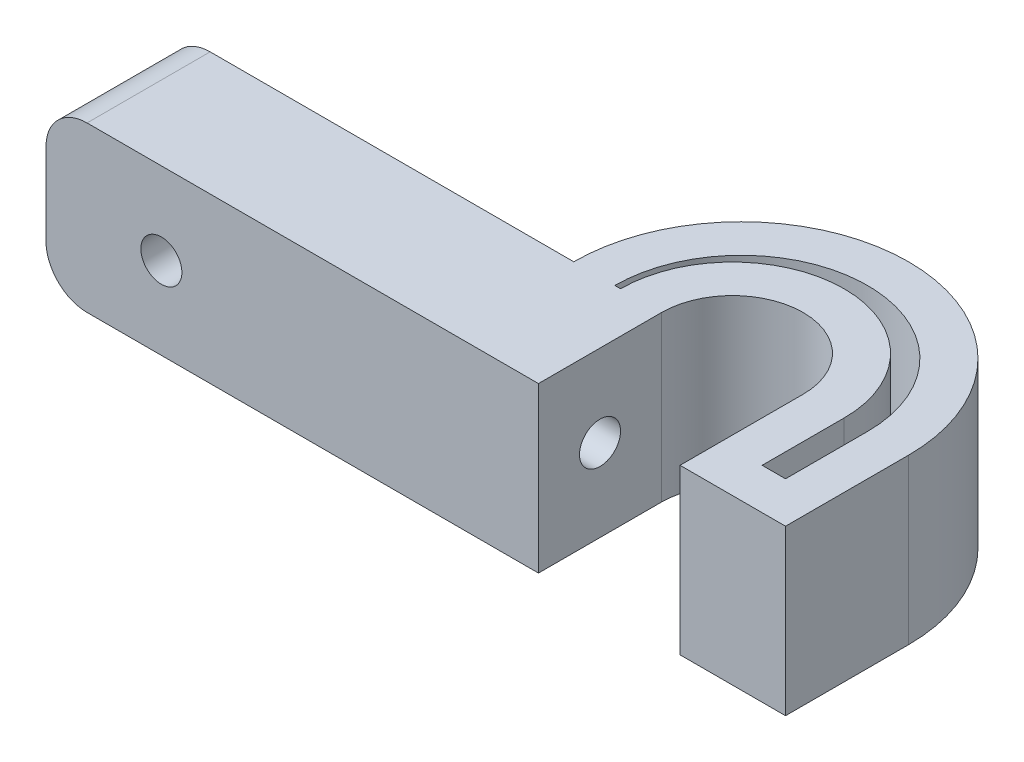
ISO-10303-21;
HEADER;
FILE_DESCRIPTION(('STEP AP214'),'2;1');
FILE_NAME('part.step','',(''),(''),'','','');
FILE_SCHEMA(('AUTOMOTIVE_DESIGN { 1 0 10303 214 1 1 1 1 }'));
ENDSEC;
DATA;
#1=APPLICATION_CONTEXT('core data for automotive mechanical design processes');
#2=APPLICATION_PROTOCOL_DEFINITION('international standard','automotive_design',2000,#1);
#3=PRODUCT_CONTEXT('',#1,'mechanical');
#4=PRODUCT('Part','Part','',(#3));
#5=PRODUCT_RELATED_PRODUCT_CATEGORY('part','',(#4));
#6=PRODUCT_DEFINITION_FORMATION('','',#4);
#7=PRODUCT_DEFINITION_CONTEXT('part definition',#1,'design');
#8=PRODUCT_DEFINITION('design','',#6,#7);
#9=PRODUCT_DEFINITION_SHAPE('','',#8);
#10=(LENGTH_UNIT() NAMED_UNIT(*) SI_UNIT(.MILLI.,.METRE.));
#11=(NAMED_UNIT(*) PLANE_ANGLE_UNIT() SI_UNIT($,.RADIAN.));
#12=(NAMED_UNIT(*) SI_UNIT($,.STERADIAN.) SOLID_ANGLE_UNIT());
#13=UNCERTAINTY_MEASURE_WITH_UNIT(LENGTH_MEASURE(1.E-05),#10,'distance_accuracy_value','');
#14=(GEOMETRIC_REPRESENTATION_CONTEXT(3) GLOBAL_UNCERTAINTY_ASSIGNED_CONTEXT((#13)) GLOBAL_UNIT_ASSIGNED_CONTEXT((#10,
#11,#12)) REPRESENTATION_CONTEXT('',''));
#15=CARTESIAN_POINT('',(0.,0.,0.));
#16=DIRECTION('',(0.,0.,1.));
#17=DIRECTION('',(1.,0.,0.));
#18=AXIS2_PLACEMENT_3D('',#15,#16,#17);
#19=CARTESIAN_POINT('',(-50.,10.,0.));
#20=DIRECTION('',(0.,0.,-1.));
#21=DIRECTION('',(-1.,0.,0.));
#22=AXIS2_PLACEMENT_3D('',#19,#20,#21);
#23=PLANE('',#22);
#24=DIRECTION('',(1.,0.,0.));
#25=VECTOR('',#24,1.);
#26=CARTESIAN_POINT('',(-49.9999999999999,-20.,0.));
#27=LINE('',#26,#25);
#28=CARTESIAN_POINT('',(48.6040885521621,-20.,0.));
#29=VERTEX_POINT('',#28);
#30=CARTESIAN_POINT('',(50.,-20.,0.));
#31=VERTEX_POINT('',#30);
#32=EDGE_CURVE('E158',#29,#31,#27,.T.);
#33=ORIENTED_EDGE('',*,*,#32,.F.);
#34=DIRECTION('',(0.,1.,0.));
#35=VECTOR('',#34,1.);
#36=CARTESIAN_POINT('',(48.6040885521621,-20.,0.));
#37=LINE('',#36,#35);
#38=CARTESIAN_POINT('',(48.6040885521621,20.,0.));
#39=VERTEX_POINT('',#38);
#40=EDGE_CURVE('E168',#29,#39,#37,.T.);
#41=ORIENTED_EDGE('',*,*,#40,.T.);
#42=DIRECTION('',(-1.,0.,0.));
#43=VECTOR('',#42,1.);
#44=CARTESIAN_POINT('',(-49.9999999999999,20.,0.));
#45=LINE('',#44,#43);
#46=CARTESIAN_POINT('',(50.,20.,0.));
#47=VERTEX_POINT('',#46);
#48=EDGE_CURVE('E217',#47,#39,#45,.T.);
#49=ORIENTED_EDGE('',*,*,#48,.F.);
#50=DIRECTION('',(0.,1.,0.));
#51=VECTOR('',#50,1.);
#52=CARTESIAN_POINT('',(50.,-20.,0.));
#53=LINE('',#52,#51);
#54=EDGE_CURVE('E178',#31,#47,#53,.T.);
#55=ORIENTED_EDGE('',*,*,#54,.F.);
#56=EDGE_LOOP('',(#33,#41,#49,#55));
#57=FACE_BOUND('',#56,.T.);
#58=ADVANCED_FACE('F33',(#57),#23,.T.);
#59=DIRECTION('',(0.,1.,0.));
#60=VECTOR('',#59,1.);
#61=CARTESIAN_POINT('',(38.6040885521621,-20.,0.));
#62=LINE('',#61,#60);
#63=CARTESIAN_POINT('',(38.6040885521621,-20.,0.));
#64=VERTEX_POINT('',#63);
#65=CARTESIAN_POINT('',(38.6040885521621,20.,0.));
#66=VERTEX_POINT('',#65);
#67=EDGE_CURVE('E175',#64,#66,#62,.T.);
#68=ORIENTED_EDGE('',*,*,#67,.F.);
#69=CARTESIAN_POINT('',(-49.9999999999999,-20.,0.));
#70=VERTEX_POINT('',#69);
#71=EDGE_CURVE('E179',#70,#64,#27,.T.);
#72=ORIENTED_EDGE('',*,*,#71,.F.);
#73=CARTESIAN_POINT('',(-50.,-10.,0.));
#74=DIRECTION('',(0.,0.,1.));
#75=DIRECTION('',(-1.,0.,0.));
#76=AXIS2_PLACEMENT_3D('',#73,#74,#75);
#77=CIRCLE('',#76,10.);
#78=CARTESIAN_POINT('',(-60.,-10.,0.));
#79=VERTEX_POINT('',#78);
#80=EDGE_CURVE('E180',#79,#70,#77,.T.);
#81=ORIENTED_EDGE('',*,*,#80,.F.);
#82=DIRECTION('',(0.,-1.,0.));
#83=VECTOR('',#82,1.);
#84=CARTESIAN_POINT('',(-60.,-9.99999999999993,0.));
#85=LINE('',#84,#83);
#86=CARTESIAN_POINT('',(-60.,9.99999999999993,0.));
#87=VERTEX_POINT('',#86);
#88=EDGE_CURVE('E184',#87,#79,#85,.T.);
#89=ORIENTED_EDGE('',*,*,#88,.F.);
#90=CARTESIAN_POINT('',(-50.,10.,0.));
#91=DIRECTION('',(0.,0.,1.));
#92=DIRECTION('',(-1.,0.,0.));
#93=AXIS2_PLACEMENT_3D('',#90,#91,#92);
#94=CIRCLE('',#93,10.);
#95=CARTESIAN_POINT('',(-49.9999999999999,20.,0.));
#96=VERTEX_POINT('',#95);
#97=EDGE_CURVE('E207',#96,#87,#94,.T.);
#98=ORIENTED_EDGE('',*,*,#97,.F.);
#99=EDGE_CURVE('E215',#66,#96,#45,.T.);
#100=ORIENTED_EDGE('',*,*,#99,.F.);
#101=EDGE_LOOP('',(#68,#72,#81,#89,#98,#100));
#102=FACE_BOUND('',#101,.T.);
#103=CARTESIAN_POINT('',(-31.8867800357313,0.,0.));
#104=DIRECTION('',(0.,0.,-1.));
#105=DIRECTION('',(-1.,0.,0.));
#106=AXIS2_PLACEMENT_3D('',#103,#104,#105);
#107=CIRCLE('',#106,5.);
#108=CARTESIAN_POINT('',(-36.8867800357313,0.,0.));
#109=VERTEX_POINT('',#108);
#110=EDGE_CURVE('E237',#109,#109,#107,.T.);
#111=ORIENTED_EDGE('',*,*,#110,.F.);
#112=EDGE_LOOP('',(#111));
#113=FACE_BOUND('',#112,.T.);
#114=ADVANCED_FACE('F213',(#102,#113),#23,.T.);
#115=CARTESIAN_POINT('',(60.,-20.,30.));
#116=DIRECTION('',(-1.,0.,0.));
#117=DIRECTION('',(0.,0.,1.));
#118=AXIS2_PLACEMENT_3D('',#115,#116,#117);
#119=PLANE('',#118);
#120=CARTESIAN_POINT('',(60.,1.14491749414469E-13,14.9999999999999));
#121=DIRECTION('',(1.,0.,0.));
#122=DIRECTION('',(0.,0.,-1.));
#123=AXIS2_PLACEMENT_3D('',#120,#121,#122);
#124=CIRCLE('',#123,5.);
#125=CARTESIAN_POINT('',(60.,1.14491749414469E-13,9.9999999999999));
#126=VERTEX_POINT('',#125);
#127=EDGE_CURVE('E174',#126,#126,#124,.T.);
#128=ORIENTED_EDGE('',*,*,#127,.F.);
#129=EDGE_LOOP('',(#128));
#130=FACE_BOUND('',#129,.T.);
#131=DIRECTION('',(0.,1.,0.));
#132=VECTOR('',#131,1.);
#133=CARTESIAN_POINT('',(60.,-20.,0.));
#134=LINE('',#133,#132);
#135=CARTESIAN_POINT('',(60.,-20.,0.));
#136=VERTEX_POINT('',#135);
#137=CARTESIAN_POINT('',(60.,20.,0.));
#138=VERTEX_POINT('',#137);
#139=EDGE_CURVE('E221',#136,#138,#134,.T.);
#140=ORIENTED_EDGE('',*,*,#139,.T.);
#141=DIRECTION('',(0.,0.,-1.));
#142=VECTOR('',#141,1.);
#143=CARTESIAN_POINT('',(60.,20.,30.));
#144=LINE('',#143,#142);
#145=CARTESIAN_POINT('',(60.,20.,30.));
#146=VERTEX_POINT('',#145);
#147=EDGE_CURVE('E11',#146,#138,#144,.T.);
#148=ORIENTED_EDGE('',*,*,#147,.F.);
#149=DIRECTION('',(0.,1.,0.));
#150=VECTOR('',#149,1.);
#151=CARTESIAN_POINT('',(60.,-20.,30.));
#152=LINE('',#151,#150);
#153=CARTESIAN_POINT('',(60.,-20.,30.));
#154=VERTEX_POINT('',#153);
#155=EDGE_CURVE('E183',#154,#146,#152,.T.);
#156=ORIENTED_EDGE('',*,*,#155,.F.);
#157=DIRECTION('',(0.,0.,-1.));
#158=VECTOR('',#157,1.);
#159=CARTESIAN_POINT('',(60.,-20.,30.));
#160=LINE('',#159,#158);
#161=EDGE_CURVE('E188',#154,#136,#160,.T.);
#162=ORIENTED_EDGE('',*,*,#161,.T.);
#163=EDGE_LOOP('',(#140,#148,#156,#162));
#164=FACE_BOUND('',#163,.T.);
#165=ADVANCED_FACE('F35',(#130,#164),#119,.F.);
#166=CARTESIAN_POINT('',(-49.9999999999999,20.,30.));
#167=DIRECTION('',(0.,-1.,0.));
#168=DIRECTION('',(0.,0.,-1.));
#169=AXIS2_PLACEMENT_3D('',#166,#167,#168);
#170=PLANE('',#169);
#171=CARTESIAN_POINT('',(77.2502818637041,20.,0.));
#172=DIRECTION('',(0.,-1.,0.));
#173=DIRECTION('',(-1.,0.,0.));
#174=AXIS2_PLACEMENT_3D('',#171,#172,#173);
#175=CIRCLE('',#174,27.2502818637041);
#176=CARTESIAN_POINT('',(104.500563727408,20.,0.));
#177=VERTEX_POINT('',#176);
#178=EDGE_CURVE('E56',#47,#177,#175,.T.);
#179=ORIENTED_EDGE('',*,*,#178,.F.);
#180=ORIENTED_EDGE('',*,*,#48,.T.);
#181=CARTESIAN_POINT('',(79.4023261397851,20.,0.));
#182=DIRECTION('',(0.,-1.,0.));
#183=DIRECTION('',(-1.,0.,0.));
#184=AXIS2_PLACEMENT_3D('',#181,#182,#183);
#185=CIRCLE('',#184,30.7982375876231);
#186=CARTESIAN_POINT('',(110.200563727408,20.,0.));
#187=VERTEX_POINT('',#186);
#188=EDGE_CURVE('E171',#187,#39,#185,.F.);
#189=ORIENTED_EDGE('',*,*,#188,.F.);
#190=DIRECTION('',(0.,0.,-1.));
#191=VECTOR('',#190,1.);
#192=CARTESIAN_POINT('',(110.200563727408,20.,0.));
#193=LINE('',#192,#191);
#194=CARTESIAN_POINT('',(110.200563727408,20.,20.));
#195=VERTEX_POINT('',#194);
#196=EDGE_CURVE('E165',#195,#187,#193,.T.);
#197=ORIENTED_EDGE('',*,*,#196,.F.);
#198=DIRECTION('',(1.,0.,0.));
#199=VECTOR('',#198,1.);
#200=CARTESIAN_POINT('',(94.5005637274082,20.,20.));
#201=LINE('',#200,#199);
#202=CARTESIAN_POINT('',(104.500563727408,20.,20.));
#203=VERTEX_POINT('',#202);
#204=EDGE_CURVE('E267',#203,#195,#201,.T.);
#205=ORIENTED_EDGE('',*,*,#204,.F.);
#206=DIRECTION('',(0.,0.,-1.));
#207=VECTOR('',#206,1.);
#208=CARTESIAN_POINT('',(104.500563727408,20.,30.));
#209=LINE('',#208,#207);
#210=EDGE_CURVE('E269',#177,#203,#209,.F.);
#211=ORIENTED_EDGE('',*,*,#210,.F.);
#212=EDGE_LOOP('',(#179,#180,#189,#197,#205,#211));
#213=FACE_BOUND('',#212,.T.);
#214=ORIENTED_EDGE('',*,*,#147,.T.);
#215=CARTESIAN_POINT('',(77.2502818637041,20.,0.));
#216=DIRECTION('',(0.,-1.,0.));
#217=DIRECTION('',(0.,0.,1.));
#218=AXIS2_PLACEMENT_3D('',#215,#216,#217);
#219=CIRCLE('',#218,17.2502818637041);
#220=CARTESIAN_POINT('',(94.5005637274082,20.,0.));
#221=VERTEX_POINT('',#220);
#222=EDGE_CURVE('E272',#138,#221,#219,.T.);
#223=ORIENTED_EDGE('',*,*,#222,.T.);
#224=DIRECTION('',(0.,0.,1.));
#225=VECTOR('',#224,1.);
#226=CARTESIAN_POINT('',(94.5005637274082,20.,30.));
#227=LINE('',#226,#225);
#228=CARTESIAN_POINT('',(94.5005637274082,20.,30.));
#229=VERTEX_POINT('',#228);
#230=EDGE_CURVE('E275',#221,#229,#227,.T.);
#231=ORIENTED_EDGE('',*,*,#230,.T.);
#232=DIRECTION('',(1.,0.,0.));
#233=VECTOR('',#232,1.);
#234=CARTESIAN_POINT('',(94.5005637274082,20.,30.));
#235=LINE('',#234,#233);
#236=CARTESIAN_POINT('',(120.200563727408,20.,30.));
#237=VERTEX_POINT('',#236);
#238=EDGE_CURVE('E278',#229,#237,#235,.T.);
#239=ORIENTED_EDGE('',*,*,#238,.T.);
#240=DIRECTION('',(0.,0.,-1.));
#241=VECTOR('',#240,1.);
#242=CARTESIAN_POINT('',(120.200563727408,20.,0.));
#243=LINE('',#242,#241);
#244=CARTESIAN_POINT('',(120.200563727408,20.,0.));
#245=VERTEX_POINT('',#244);
#246=EDGE_CURVE('E281',#237,#245,#243,.T.);
#247=ORIENTED_EDGE('',*,*,#246,.T.);
#248=CARTESIAN_POINT('',(79.4023261397851,20.,0.));
#249=DIRECTION('',(0.,1.,0.));
#250=DIRECTION('',(0.,0.,1.));
#251=AXIS2_PLACEMENT_3D('',#248,#249,#250);
#252=CIRCLE('',#251,40.7982375876231);
#253=EDGE_CURVE('E48',#245,#66,#252,.T.);
#254=ORIENTED_EDGE('',*,*,#253,.T.);
#255=ORIENTED_EDGE('',*,*,#99,.T.);
#256=DIRECTION('',(0.,0.,-1.));
#257=VECTOR('',#256,1.);
#258=CARTESIAN_POINT('',(-49.9999999999999,20.,30.));
#259=LINE('',#258,#257);
#260=CARTESIAN_POINT('',(-49.9999999999999,20.,30.));
#261=VERTEX_POINT('',#260);
#262=EDGE_CURVE('E41',#261,#96,#259,.T.);
#263=ORIENTED_EDGE('',*,*,#262,.F.);
#264=DIRECTION('',(-1.,0.,0.));
#265=VECTOR('',#264,1.);
#266=CARTESIAN_POINT('',(-49.9999999999999,20.,30.));
#267=LINE('',#266,#265);
#268=EDGE_CURVE('E231',#146,#261,#267,.T.);
#269=ORIENTED_EDGE('',*,*,#268,.F.);
#270=EDGE_LOOP('',(#214,#223,#231,#239,#247,#254,#255,#263,#269));
#271=FACE_BOUND('',#270,.T.);
#272=ADVANCED_FACE('F325',(#213,#271),#170,.F.);
#273=CARTESIAN_POINT('',(-50.,10.,30.));
#274=DIRECTION('',(0.,0.,-1.));
#275=DIRECTION('',(-1.,0.,0.));
#276=AXIS2_PLACEMENT_3D('',#273,#274,#275);
#277=CYLINDRICAL_SURFACE('',#276,10.);
#278=ORIENTED_EDGE('',*,*,#97,.T.);
#279=DIRECTION('',(0.,0.,-1.));
#280=VECTOR('',#279,1.);
#281=CARTESIAN_POINT('',(-60.,9.99999999999993,30.));
#282=LINE('',#281,#280);
#283=CARTESIAN_POINT('',(-60.,9.99999999999993,30.));
#284=VERTEX_POINT('',#283);
#285=EDGE_CURVE('E198',#284,#87,#282,.T.);
#286=ORIENTED_EDGE('',*,*,#285,.F.);
#287=CARTESIAN_POINT('',(-50.,10.,30.));
#288=DIRECTION('',(0.,0.,1.));
#289=DIRECTION('',(-1.,0.,0.));
#290=AXIS2_PLACEMENT_3D('',#287,#288,#289);
#291=CIRCLE('',#290,10.);
#292=EDGE_CURVE('E208',#261,#284,#291,.T.);
#293=ORIENTED_EDGE('',*,*,#292,.F.);
#294=ORIENTED_EDGE('',*,*,#262,.T.);
#295=EDGE_LOOP('',(#278,#286,#293,#294));
#296=FACE_BOUND('',#295,.T.);
#297=ADVANCED_FACE('F205',(#296),#277,.T.);
#298=CARTESIAN_POINT('',(-60.,-9.99999999999993,30.));
#299=DIRECTION('',(1.,0.,0.));
#300=DIRECTION('',(0.,0.,-1.));
#301=AXIS2_PLACEMENT_3D('',#298,#299,#300);
#302=PLANE('',#301);
#303=ORIENTED_EDGE('',*,*,#88,.T.);
#304=DIRECTION('',(0.,0.,-1.));
#305=VECTOR('',#304,1.);
#306=CARTESIAN_POINT('',(-60.,-10.,30.));
#307=LINE('',#306,#305);
#308=CARTESIAN_POINT('',(-60.,-10.,30.));
#309=VERTEX_POINT('',#308);
#310=EDGE_CURVE('E195',#309,#79,#307,.T.);
#311=ORIENTED_EDGE('',*,*,#310,.F.);
#312=DIRECTION('',(0.,-1.,0.));
#313=VECTOR('',#312,1.);
#314=CARTESIAN_POINT('',(-60.,-9.99999999999993,30.));
#315=LINE('',#314,#313);
#316=EDGE_CURVE('E228',#284,#309,#315,.T.);
#317=ORIENTED_EDGE('',*,*,#316,.F.);
#318=ORIENTED_EDGE('',*,*,#285,.T.);
#319=EDGE_LOOP('',(#303,#311,#317,#318));
#320=FACE_BOUND('',#319,.T.);
#321=ADVANCED_FACE('F320',(#320),#302,.F.);
#322=CARTESIAN_POINT('',(-50.,-10.,30.));
#323=DIRECTION('',(0.,0.,-1.));
#324=DIRECTION('',(-1.,0.,0.));
#325=AXIS2_PLACEMENT_3D('',#322,#323,#324);
#326=CYLINDRICAL_SURFACE('',#325,10.);
#327=ORIENTED_EDGE('',*,*,#80,.T.);
#328=DIRECTION('',(0.,0.,-1.));
#329=VECTOR('',#328,1.);
#330=CARTESIAN_POINT('',(-49.9999999999999,-20.,30.));
#331=LINE('',#330,#329);
#332=CARTESIAN_POINT('',(-49.9999999999999,-20.,30.));
#333=VERTEX_POINT('',#332);
#334=EDGE_CURVE('E191',#333,#70,#331,.T.);
#335=ORIENTED_EDGE('',*,*,#334,.F.);
#336=CARTESIAN_POINT('',(-50.,-10.,30.));
#337=DIRECTION('',(0.,0.,1.));
#338=DIRECTION('',(-1.,0.,0.));
#339=AXIS2_PLACEMENT_3D('',#336,#337,#338);
#340=CIRCLE('',#339,10.);
#341=EDGE_CURVE('E226',#309,#333,#340,.T.);
#342=ORIENTED_EDGE('',*,*,#341,.F.);
#343=ORIENTED_EDGE('',*,*,#310,.T.);
#344=EDGE_LOOP('',(#327,#335,#342,#343));
#345=FACE_BOUND('',#344,.T.);
#346=ADVANCED_FACE('F316',(#345),#326,.T.);
#347=CARTESIAN_POINT('',(-49.9999999999999,-20.,30.));
#348=DIRECTION('',(0.,1.,0.));
#349=DIRECTION('',(0.,0.,1.));
#350=AXIS2_PLACEMENT_3D('',#347,#348,#349);
#351=PLANE('',#350);
#352=CARTESIAN_POINT('',(77.2502818637041,-20.,0.));
#353=DIRECTION('',(0.,-1.,0.));
#354=DIRECTION('',(0.,0.,1.));
#355=AXIS2_PLACEMENT_3D('',#352,#353,#354);
#356=CIRCLE('',#355,17.2502818637041);
#357=CARTESIAN_POINT('',(94.5005637274082,-20.,0.));
#358=VERTEX_POINT('',#357);
#359=EDGE_CURVE('E292',#136,#358,#356,.T.);
#360=ORIENTED_EDGE('',*,*,#359,.F.);
#361=ORIENTED_EDGE('',*,*,#161,.F.);
#362=DIRECTION('',(1.,0.,0.));
#363=VECTOR('',#362,1.);
#364=CARTESIAN_POINT('',(-49.9999999999999,-20.,30.));
#365=LINE('',#364,#363);
#366=EDGE_CURVE('E192',#333,#154,#365,.T.);
#367=ORIENTED_EDGE('',*,*,#366,.F.);
#368=ORIENTED_EDGE('',*,*,#334,.T.);
#369=ORIENTED_EDGE('',*,*,#71,.T.);
#370=CARTESIAN_POINT('',(79.4023261397851,-20.,0.));
#371=DIRECTION('',(0.,1.,0.));
#372=DIRECTION('',(0.,0.,1.));
#373=AXIS2_PLACEMENT_3D('',#370,#371,#372);
#374=CIRCLE('',#373,40.7982375876231);
#375=CARTESIAN_POINT('',(120.200563727408,-20.,0.));
#376=VERTEX_POINT('',#375);
#377=EDGE_CURVE('E164',#376,#64,#374,.T.);
#378=ORIENTED_EDGE('',*,*,#377,.F.);
#379=DIRECTION('',(0.,0.,-1.));
#380=VECTOR('',#379,1.);
#381=CARTESIAN_POINT('',(120.200563727408,-20.,0.));
#382=LINE('',#381,#380);
#383=CARTESIAN_POINT('',(120.200563727408,-20.,30.));
#384=VERTEX_POINT('',#383);
#385=EDGE_CURVE('E301',#384,#376,#382,.T.);
#386=ORIENTED_EDGE('',*,*,#385,.F.);
#387=DIRECTION('',(1.,0.,0.));
#388=VECTOR('',#387,1.);
#389=CARTESIAN_POINT('',(94.5005637274082,-20.,30.));
#390=LINE('',#389,#388);
#391=CARTESIAN_POINT('',(94.5005637274082,-20.,30.));
#392=VERTEX_POINT('',#391);
#393=EDGE_CURVE('E298',#392,#384,#390,.T.);
#394=ORIENTED_EDGE('',*,*,#393,.F.);
#395=DIRECTION('',(0.,0.,1.));
#396=VECTOR('',#395,1.);
#397=CARTESIAN_POINT('',(94.5005637274082,-20.,30.));
#398=LINE('',#397,#396);
#399=EDGE_CURVE('E295',#358,#392,#398,.T.);
#400=ORIENTED_EDGE('',*,*,#399,.F.);
#401=EDGE_LOOP('',(#360,#361,#367,#368,#369,#378,#386,#394,#400));
#402=FACE_BOUND('',#401,.T.);
#403=ORIENTED_EDGE('',*,*,#32,.T.);
#404=CARTESIAN_POINT('',(77.2502818637041,-20.,0.));
#405=DIRECTION('',(0.,-1.,0.));
#406=DIRECTION('',(-1.,0.,0.));
#407=AXIS2_PLACEMENT_3D('',#404,#405,#406);
#408=CIRCLE('',#407,27.2502818637041);
#409=CARTESIAN_POINT('',(104.500563727408,-20.,0.));
#410=VERTEX_POINT('',#409);
#411=EDGE_CURVE('E290',#31,#410,#408,.T.);
#412=ORIENTED_EDGE('',*,*,#411,.T.);
#413=DIRECTION('',(0.,0.,-1.));
#414=VECTOR('',#413,1.);
#415=CARTESIAN_POINT('',(104.500563727408,-20.,30.));
#416=LINE('',#415,#414);
#417=CARTESIAN_POINT('',(104.500563727408,-20.,20.));
#418=VERTEX_POINT('',#417);
#419=EDGE_CURVE('E288',#410,#418,#416,.F.);
#420=ORIENTED_EDGE('',*,*,#419,.T.);
#421=DIRECTION('',(1.,0.,0.));
#422=VECTOR('',#421,1.);
#423=CARTESIAN_POINT('',(94.5005637274082,-20.,20.));
#424=LINE('',#423,#422);
#425=CARTESIAN_POINT('',(110.200563727408,-20.,20.));
#426=VERTEX_POINT('',#425);
#427=EDGE_CURVE('E286',#418,#426,#424,.T.);
#428=ORIENTED_EDGE('',*,*,#427,.T.);
#429=DIRECTION('',(0.,0.,-1.));
#430=VECTOR('',#429,1.);
#431=CARTESIAN_POINT('',(110.200563727408,-20.,0.));
#432=LINE('',#431,#430);
#433=CARTESIAN_POINT('',(110.200563727408,-20.,0.));
#434=VERTEX_POINT('',#433);
#435=EDGE_CURVE('E160',#426,#434,#432,.T.);
#436=ORIENTED_EDGE('',*,*,#435,.T.);
#437=CARTESIAN_POINT('',(79.4023261397851,-20.,0.));
#438=DIRECTION('',(0.,-1.,0.));
#439=DIRECTION('',(-1.,0.,0.));
#440=AXIS2_PLACEMENT_3D('',#437,#438,#439);
#441=CIRCLE('',#440,30.7982375876231);
#442=EDGE_CURVE('E154',#434,#29,#441,.F.);
#443=ORIENTED_EDGE('',*,*,#442,.T.);
#444=EDGE_LOOP('',(#403,#412,#420,#428,#436,#443));
#445=FACE_BOUND('',#444,.T.);
#446=ADVANCED_FACE('F156',(#402,#445),#351,.F.);
#447=CARTESIAN_POINT('',(-50.,10.,30.));
#448=DIRECTION('',(0.,0.,-1.));
#449=DIRECTION('',(-1.,0.,0.));
#450=AXIS2_PLACEMENT_3D('',#447,#448,#449);
#451=PLANE('',#450);
#452=CARTESIAN_POINT('',(-31.8867800357313,0.,30.));
#453=DIRECTION('',(0.,0.,-1.));
#454=DIRECTION('',(-1.,0.,0.));
#455=AXIS2_PLACEMENT_3D('',#452,#453,#454);
#456=CIRCLE('',#455,5.);
#457=CARTESIAN_POINT('',(-36.8867800357313,0.,30.));
#458=VERTEX_POINT('',#457);
#459=EDGE_CURVE('E224',#458,#458,#456,.T.);
#460=ORIENTED_EDGE('',*,*,#459,.T.);
#461=EDGE_LOOP('',(#460));
#462=FACE_BOUND('',#461,.T.);
#463=ORIENTED_EDGE('',*,*,#155,.T.);
#464=ORIENTED_EDGE('',*,*,#268,.T.);
#465=ORIENTED_EDGE('',*,*,#292,.T.);
#466=ORIENTED_EDGE('',*,*,#316,.T.);
#467=ORIENTED_EDGE('',*,*,#341,.T.);
#468=ORIENTED_EDGE('',*,*,#366,.T.);
#469=EDGE_LOOP('',(#463,#464,#465,#466,#467,#468));
#470=FACE_BOUND('',#469,.T.);
#471=ADVANCED_FACE('F322',(#462,#470),#451,.F.);
#472=CARTESIAN_POINT('',(-31.8867800357313,0.,40.));
#473=DIRECTION('',(0.,0.,-1.));
#474=DIRECTION('',(-1.,0.,0.));
#475=AXIS2_PLACEMENT_3D('',#472,#473,#474);
#476=CYLINDRICAL_SURFACE('',#475,5.);
#477=ORIENTED_EDGE('',*,*,#110,.T.);
#478=EDGE_LOOP('',(#477));
#479=FACE_BOUND('',#478,.T.);
#480=ORIENTED_EDGE('',*,*,#459,.F.);
#481=EDGE_LOOP('',(#480));
#482=FACE_BOUND('',#481,.T.);
#483=ADVANCED_FACE('F375',(#479,#482),#476,.F.);
#484=CARTESIAN_POINT('',(30.,1.14491749414469E-13,14.9999999999999));
#485=DIRECTION('',(1.,0.,0.));
#486=DIRECTION('',(0.,0.,-1.));
#487=AXIS2_PLACEMENT_3D('',#484,#485,#486);
#488=CYLINDRICAL_SURFACE('',#487,5.);
#489=CARTESIAN_POINT('',(30.,1.14491749414469E-13,14.9999999999999));
#490=DIRECTION('',(1.,0.,0.));
#491=DIRECTION('',(0.,0.,-1.));
#492=AXIS2_PLACEMENT_3D('',#489,#490,#491);
#493=CIRCLE('',#492,5.);
#494=CARTESIAN_POINT('',(30.,1.14491749414469E-13,9.9999999999999));
#495=VERTEX_POINT('',#494);
#496=EDGE_CURVE('E240',#495,#495,#493,.T.);
#497=ORIENTED_EDGE('',*,*,#496,.F.);
#498=EDGE_LOOP('',(#497));
#499=FACE_BOUND('',#498,.T.);
#500=ORIENTED_EDGE('',*,*,#127,.T.);
#501=EDGE_LOOP('',(#500));
#502=FACE_BOUND('',#501,.T.);
#503=ADVANCED_FACE('F372',(#499,#502),#488,.F.);
#504=CARTESIAN_POINT('',(30.,1.14491749414469E-13,14.9999999999999));
#505=DIRECTION('',(1.,0.,0.));
#506=DIRECTION('',(0.,0.,-1.));
#507=AXIS2_PLACEMENT_3D('',#504,#505,#506);
#508=PLANE('',#507);
#509=ORIENTED_EDGE('',*,*,#496,.T.);
#510=EDGE_LOOP('',(#509));
#511=FACE_BOUND('',#510,.T.);
#512=ADVANCED_FACE('F374',(#511),#508,.T.);
#513=CARTESIAN_POINT('',(79.4023261397851,-20.,0.));
#514=DIRECTION('',(0.,1.,0.));
#515=DIRECTION('',(0.,0.,1.));
#516=AXIS2_PLACEMENT_3D('',#513,#514,#515);
#517=CYLINDRICAL_SURFACE('',#516,30.7982375876231);
#518=ORIENTED_EDGE('',*,*,#188,.T.);
#519=ORIENTED_EDGE('',*,*,#40,.F.);
#520=ORIENTED_EDGE('',*,*,#442,.F.);
#521=DIRECTION('',(0.,1.,0.));
#522=VECTOR('',#521,1.);
#523=CARTESIAN_POINT('',(110.200563727408,-20.,0.));
#524=LINE('',#523,#522);
#525=EDGE_CURVE('E264',#434,#187,#524,.T.);
#526=ORIENTED_EDGE('',*,*,#525,.T.);
#527=EDGE_LOOP('',(#518,#519,#520,#526));
#528=FACE_BOUND('',#527,.T.);
#529=ADVANCED_FACE('F169',(#528),#517,.F.);
#530=CARTESIAN_POINT('',(79.4023261397851,-20.,0.));
#531=DIRECTION('',(0.,1.,0.));
#532=DIRECTION('',(0.,0.,1.));
#533=AXIS2_PLACEMENT_3D('',#530,#531,#532);
#534=CYLINDRICAL_SURFACE('',#533,40.7982375876231);
#535=ORIENTED_EDGE('',*,*,#253,.F.);
#536=DIRECTION('',(0.,1.,0.));
#537=VECTOR('',#536,1.);
#538=CARTESIAN_POINT('',(120.200563727408,-20.,0.));
#539=LINE('',#538,#537);
#540=EDGE_CURVE('E246',#376,#245,#539,.T.);
#541=ORIENTED_EDGE('',*,*,#540,.F.);
#542=ORIENTED_EDGE('',*,*,#377,.T.);
#543=ORIENTED_EDGE('',*,*,#67,.T.);
#544=EDGE_LOOP('',(#535,#541,#542,#543));
#545=FACE_BOUND('',#544,.T.);
#546=ADVANCED_FACE('F306',(#545),#534,.T.);
#547=CARTESIAN_POINT('',(120.200563727408,-20.,0.));
#548=DIRECTION('',(1.,0.,0.));
#549=DIRECTION('',(0.,0.,-1.));
#550=AXIS2_PLACEMENT_3D('',#547,#548,#549);
#551=PLANE('',#550);
#552=ORIENTED_EDGE('',*,*,#246,.F.);
#553=DIRECTION('',(0.,1.,0.));
#554=VECTOR('',#553,1.);
#555=CARTESIAN_POINT('',(120.200563727408,-20.,30.));
#556=LINE('',#555,#554);
#557=EDGE_CURVE('E248',#384,#237,#556,.T.);
#558=ORIENTED_EDGE('',*,*,#557,.F.);
#559=ORIENTED_EDGE('',*,*,#385,.T.);
#560=ORIENTED_EDGE('',*,*,#540,.T.);
#561=EDGE_LOOP('',(#552,#558,#559,#560));
#562=FACE_BOUND('',#561,.T.);
#563=ADVANCED_FACE('F339',(#562),#551,.T.);
#564=CARTESIAN_POINT('',(94.5005637274082,-20.,30.));
#565=DIRECTION('',(0.,0.,1.));
#566=DIRECTION('',(1.,0.,0.));
#567=AXIS2_PLACEMENT_3D('',#564,#565,#566);
#568=PLANE('',#567);
#569=ORIENTED_EDGE('',*,*,#238,.F.);
#570=DIRECTION('',(0.,1.,0.));
#571=VECTOR('',#570,1.);
#572=CARTESIAN_POINT('',(94.5005637274082,-20.,30.));
#573=LINE('',#572,#571);
#574=EDGE_CURVE('E250',#392,#229,#573,.T.);
#575=ORIENTED_EDGE('',*,*,#574,.F.);
#576=ORIENTED_EDGE('',*,*,#393,.T.);
#577=ORIENTED_EDGE('',*,*,#557,.T.);
#578=EDGE_LOOP('',(#569,#575,#576,#577));
#579=FACE_BOUND('',#578,.T.);
#580=ADVANCED_FACE('F337',(#579),#568,.T.);
#581=CARTESIAN_POINT('',(94.5005637274082,-20.,30.));
#582=DIRECTION('',(-1.,0.,0.));
#583=DIRECTION('',(0.,0.,1.));
#584=AXIS2_PLACEMENT_3D('',#581,#582,#583);
#585=PLANE('',#584);
#586=ORIENTED_EDGE('',*,*,#230,.F.);
#587=DIRECTION('',(0.,1.,0.));
#588=VECTOR('',#587,1.);
#589=CARTESIAN_POINT('',(94.5005637274082,-20.,0.));
#590=LINE('',#589,#588);
#591=EDGE_CURVE('E252',#358,#221,#590,.T.);
#592=ORIENTED_EDGE('',*,*,#591,.F.);
#593=ORIENTED_EDGE('',*,*,#399,.T.);
#594=ORIENTED_EDGE('',*,*,#574,.T.);
#595=EDGE_LOOP('',(#586,#592,#593,#594));
#596=FACE_BOUND('',#595,.T.);
#597=ADVANCED_FACE('F333',(#596),#585,.T.);
#598=CARTESIAN_POINT('',(77.2502818637041,-20.,0.));
#599=DIRECTION('',(0.,1.,0.));
#600=DIRECTION('',(0.,0.,1.));
#601=AXIS2_PLACEMENT_3D('',#598,#599,#600);
#602=CYLINDRICAL_SURFACE('',#601,17.2502818637041);
#603=ORIENTED_EDGE('',*,*,#222,.F.);
#604=ORIENTED_EDGE('',*,*,#139,.F.);
#605=ORIENTED_EDGE('',*,*,#359,.T.);
#606=ORIENTED_EDGE('',*,*,#591,.T.);
#607=EDGE_LOOP('',(#603,#604,#605,#606));
#608=FACE_BOUND('',#607,.T.);
#609=ADVANCED_FACE('F328',(#608),#602,.F.);
#610=CARTESIAN_POINT('',(77.2502818637041,-20.,0.));
#611=DIRECTION('',(0.,1.,0.));
#612=DIRECTION('',(0.,0.,1.));
#613=AXIS2_PLACEMENT_3D('',#610,#611,#612);
#614=CYLINDRICAL_SURFACE('',#613,27.2502818637041);
#615=ORIENTED_EDGE('',*,*,#178,.T.);
#616=DIRECTION('',(0.,1.,0.));
#617=VECTOR('',#616,1.);
#618=CARTESIAN_POINT('',(104.500563727408,-20.,0.));
#619=LINE('',#618,#617);
#620=EDGE_CURVE('E255',#410,#177,#619,.T.);
#621=ORIENTED_EDGE('',*,*,#620,.F.);
#622=ORIENTED_EDGE('',*,*,#411,.F.);
#623=ORIENTED_EDGE('',*,*,#54,.T.);
#624=EDGE_LOOP('',(#615,#621,#622,#623));
#625=FACE_BOUND('',#624,.T.);
#626=ADVANCED_FACE('F424',(#625),#614,.T.);
#627=CARTESIAN_POINT('',(104.500563727408,-20.,30.));
#628=DIRECTION('',(-1.,0.,0.));
#629=DIRECTION('',(0.,0.,1.));
#630=AXIS2_PLACEMENT_3D('',#627,#628,#629);
#631=PLANE('',#630);
#632=ORIENTED_EDGE('',*,*,#210,.T.);
#633=DIRECTION('',(0.,1.,0.));
#634=VECTOR('',#633,1.);
#635=CARTESIAN_POINT('',(104.500563727408,-20.,20.));
#636=LINE('',#635,#634);
#637=EDGE_CURVE('E258',#418,#203,#636,.T.);
#638=ORIENTED_EDGE('',*,*,#637,.F.);
#639=ORIENTED_EDGE('',*,*,#419,.F.);
#640=ORIENTED_EDGE('',*,*,#620,.T.);
#641=EDGE_LOOP('',(#632,#638,#639,#640));
#642=FACE_BOUND('',#641,.T.);
#643=ADVANCED_FACE('F433',(#642),#631,.F.);
#644=CARTESIAN_POINT('',(94.5005637274082,-20.,20.));
#645=DIRECTION('',(0.,0.,1.));
#646=DIRECTION('',(1.,0.,0.));
#647=AXIS2_PLACEMENT_3D('',#644,#645,#646);
#648=PLANE('',#647);
#649=ORIENTED_EDGE('',*,*,#204,.T.);
#650=DIRECTION('',(0.,1.,0.));
#651=VECTOR('',#650,1.);
#652=CARTESIAN_POINT('',(110.200563727408,-20.,20.));
#653=LINE('',#652,#651);
#654=EDGE_CURVE('E261',#426,#195,#653,.T.);
#655=ORIENTED_EDGE('',*,*,#654,.F.);
#656=ORIENTED_EDGE('',*,*,#427,.F.);
#657=ORIENTED_EDGE('',*,*,#637,.T.);
#658=EDGE_LOOP('',(#649,#655,#656,#657));
#659=FACE_BOUND('',#658,.T.);
#660=ADVANCED_FACE('F443',(#659),#648,.F.);
#661=CARTESIAN_POINT('',(110.200563727408,-20.,0.));
#662=DIRECTION('',(1.,0.,0.));
#663=DIRECTION('',(0.,0.,-1.));
#664=AXIS2_PLACEMENT_3D('',#661,#662,#663);
#665=PLANE('',#664);
#666=ORIENTED_EDGE('',*,*,#196,.T.);
#667=ORIENTED_EDGE('',*,*,#525,.F.);
#668=ORIENTED_EDGE('',*,*,#435,.F.);
#669=ORIENTED_EDGE('',*,*,#654,.T.);
#670=EDGE_LOOP('',(#666,#667,#668,#669));
#671=FACE_BOUND('',#670,.T.);
#672=ADVANCED_FACE('F453',(#671),#665,.F.);
#673=CLOSED_SHELL('',(#58,#114,#165,#272,#297,#321,#346,#446,#471,#483,#503,#512,#529,#546,#563,
#580,#597,#609,#626,#643,#660,#672));
#674=MANIFOLD_SOLID_BREP('B2',#673);
#675=ADVANCED_BREP_SHAPE_REPRESENTATION('',(#18,#674),#14);
#676=SHAPE_DEFINITION_REPRESENTATION(#9,#675);
ENDSEC;
END-ISO-10303-21;
